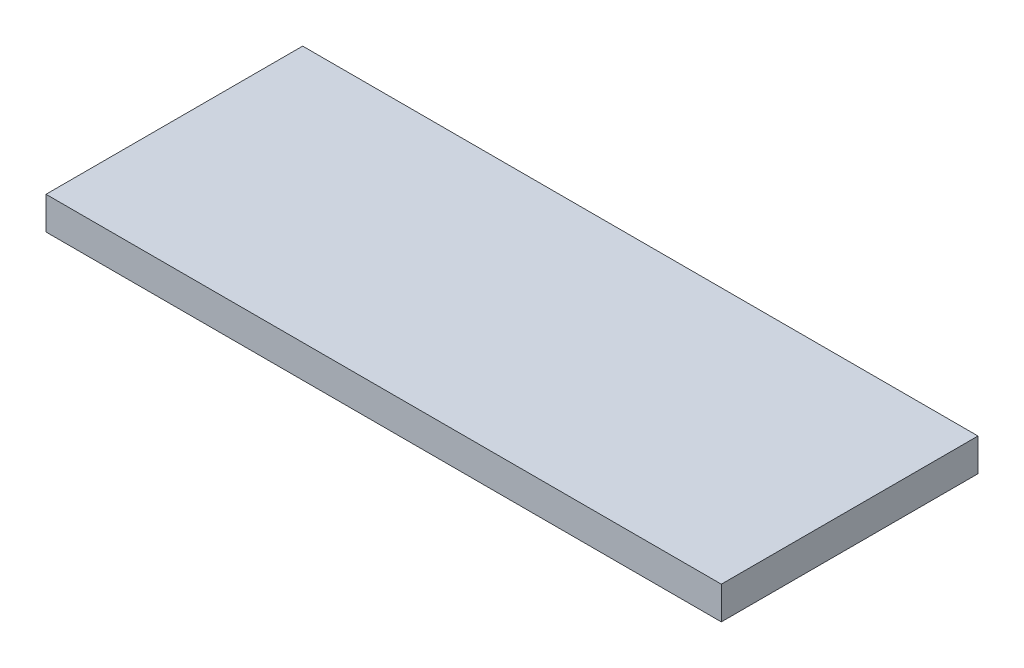
ISO-10303-21;
HEADER;
FILE_DESCRIPTION(('STEP AP214'),'2;1');
FILE_NAME('part.step','',(''),(''),'','','');
FILE_SCHEMA(('AUTOMOTIVE_DESIGN { 1 0 10303 214 1 1 1 1 }'));
ENDSEC;
DATA;
#1=APPLICATION_CONTEXT('core data for automotive mechanical design processes');
#2=APPLICATION_PROTOCOL_DEFINITION('international standard','automotive_design',2000,#1);
#3=PRODUCT_CONTEXT('',#1,'mechanical');
#4=PRODUCT('Part','Part','',(#3));
#5=PRODUCT_RELATED_PRODUCT_CATEGORY('part','',(#4));
#6=PRODUCT_DEFINITION_FORMATION('','',#4);
#7=PRODUCT_DEFINITION_CONTEXT('part definition',#1,'design');
#8=PRODUCT_DEFINITION('design','',#6,#7);
#9=PRODUCT_DEFINITION_SHAPE('','',#8);
#10=(LENGTH_UNIT() NAMED_UNIT(*) SI_UNIT(.MILLI.,.METRE.));
#11=(NAMED_UNIT(*) PLANE_ANGLE_UNIT() SI_UNIT($,.RADIAN.));
#12=(NAMED_UNIT(*) SI_UNIT($,.STERADIAN.) SOLID_ANGLE_UNIT());
#13=UNCERTAINTY_MEASURE_WITH_UNIT(LENGTH_MEASURE(1.E-05),#10,'distance_accuracy_value','');
#14=(GEOMETRIC_REPRESENTATION_CONTEXT(3) GLOBAL_UNCERTAINTY_ASSIGNED_CONTEXT((#13)) GLOBAL_UNIT_ASSIGNED_CONTEXT((#10,
#11,#12)) REPRESENTATION_CONTEXT('',''));
#15=CARTESIAN_POINT('',(0.,0.,0.));
#16=DIRECTION('',(0.,0.,1.));
#17=DIRECTION('',(1.,0.,0.));
#18=AXIS2_PLACEMENT_3D('',#15,#16,#17);
#19=CARTESIAN_POINT('',(0.,0.8509,0.));
#20=DIRECTION('',(1.,0.,0.));
#21=DIRECTION('',(0.,0.,-1.));
#22=AXIS2_PLACEMENT_3D('',#19,#20,#21);
#23=PLANE('',#22);
#24=DIRECTION('',(0.,0.,1.));
#25=VECTOR('',#24,1.);
#26=CARTESIAN_POINT('',(0.,0.,0.));
#27=LINE('',#26,#25);
#28=CARTESIAN_POINT('',(0.,0.,-6.6802));
#29=VERTEX_POINT('',#28);
#30=CARTESIAN_POINT('',(0.,0.,0.));
#31=VERTEX_POINT('',#30);
#32=EDGE_CURVE('E96',#29,#31,#27,.T.);
#33=ORIENTED_EDGE('',*,*,#32,.T.);
#34=DIRECTION('',(0.,-1.,0.));
#35=VECTOR('',#34,1.);
#36=CARTESIAN_POINT('',(0.,0.8509,0.));
#37=LINE('',#36,#35);
#38=CARTESIAN_POINT('',(0.,0.8509,0.));
#39=VERTEX_POINT('',#38);
#40=EDGE_CURVE('E11',#39,#31,#37,.T.);
#41=ORIENTED_EDGE('',*,*,#40,.F.);
#42=DIRECTION('',(0.,0.,1.));
#43=VECTOR('',#42,1.);
#44=CARTESIAN_POINT('',(0.,0.8509,0.));
#45=LINE('',#44,#43);
#46=CARTESIAN_POINT('',(0.,0.8509,-6.6802));
#47=VERTEX_POINT('',#46);
#48=EDGE_CURVE('E84',#47,#39,#45,.T.);
#49=ORIENTED_EDGE('',*,*,#48,.F.);
#50=DIRECTION('',(0.,-1.,0.));
#51=VECTOR('',#50,1.);
#52=CARTESIAN_POINT('',(0.,0.8509,-6.6802));
#53=LINE('',#52,#51);
#54=EDGE_CURVE('E92',#47,#29,#53,.T.);
#55=ORIENTED_EDGE('',*,*,#54,.T.);
#56=EDGE_LOOP('',(#33,#41,#49,#55));
#57=FACE_BOUND('',#56,.T.);
#58=ADVANCED_FACE('F33',(#57),#23,.F.);
#59=CARTESIAN_POINT('',(0.,0.8509,0.));
#60=DIRECTION('',(0.,0.,-1.));
#61=DIRECTION('',(-1.,0.,0.));
#62=AXIS2_PLACEMENT_3D('',#59,#60,#61);
#63=PLANE('',#62);
#64=DIRECTION('',(1.,0.,0.));
#65=VECTOR('',#64,1.);
#66=CARTESIAN_POINT('',(0.,0.,0.));
#67=LINE('',#66,#65);
#68=CARTESIAN_POINT('',(17.5768,0.,0.));
#69=VERTEX_POINT('',#68);
#70=EDGE_CURVE('E88',#31,#69,#67,.T.);
#71=ORIENTED_EDGE('',*,*,#70,.T.);
#72=DIRECTION('',(0.,-1.,0.));
#73=VECTOR('',#72,1.);
#74=CARTESIAN_POINT('',(17.5768,0.8509,0.));
#75=LINE('',#74,#73);
#76=CARTESIAN_POINT('',(17.5768,0.8509,0.));
#77=VERTEX_POINT('',#76);
#78=EDGE_CURVE('E41',#77,#69,#75,.T.);
#79=ORIENTED_EDGE('',*,*,#78,.F.);
#80=DIRECTION('',(1.,0.,0.));
#81=VECTOR('',#80,1.);
#82=CARTESIAN_POINT('',(0.,0.8509,0.));
#83=LINE('',#82,#81);
#84=EDGE_CURVE('E79',#39,#77,#83,.T.);
#85=ORIENTED_EDGE('',*,*,#84,.F.);
#86=ORIENTED_EDGE('',*,*,#40,.T.);
#87=EDGE_LOOP('',(#71,#79,#85,#86));
#88=FACE_BOUND('',#87,.T.);
#89=ADVANCED_FACE('F87',(#88),#63,.F.);
#90=CARTESIAN_POINT('',(17.5768,0.8509,0.));
#91=DIRECTION('',(-1.,0.,0.));
#92=DIRECTION('',(0.,0.,1.));
#93=AXIS2_PLACEMENT_3D('',#90,#91,#92);
#94=PLANE('',#93);
#95=DIRECTION('',(0.,0.,-1.));
#96=VECTOR('',#95,1.);
#97=CARTESIAN_POINT('',(17.5768,0.,0.));
#98=LINE('',#97,#96);
#99=CARTESIAN_POINT('',(17.5768,0.,-6.6802));
#100=VERTEX_POINT('',#99);
#101=EDGE_CURVE('E66',#69,#100,#98,.T.);
#102=ORIENTED_EDGE('',*,*,#101,.T.);
#103=DIRECTION('',(0.,-1.,0.));
#104=VECTOR('',#103,1.);
#105=CARTESIAN_POINT('',(17.5768,0.8509,-6.6802));
#106=LINE('',#105,#104);
#107=CARTESIAN_POINT('',(17.5768,0.8509,-6.6802));
#108=VERTEX_POINT('',#107);
#109=EDGE_CURVE('E89',#108,#100,#106,.T.);
#110=ORIENTED_EDGE('',*,*,#109,.F.);
#111=DIRECTION('',(0.,0.,-1.));
#112=VECTOR('',#111,1.);
#113=CARTESIAN_POINT('',(17.5768,0.8509,0.));
#114=LINE('',#113,#112);
#115=EDGE_CURVE('E82',#77,#108,#114,.T.);
#116=ORIENTED_EDGE('',*,*,#115,.F.);
#117=ORIENTED_EDGE('',*,*,#78,.T.);
#118=EDGE_LOOP('',(#102,#110,#116,#117));
#119=FACE_BOUND('',#118,.T.);
#120=ADVANCED_FACE('F90',(#119),#94,.F.);
#121=CARTESIAN_POINT('',(0.,0.8509,-6.6802));
#122=DIRECTION('',(0.,0.,1.));
#123=DIRECTION('',(1.,0.,0.));
#124=AXIS2_PLACEMENT_3D('',#121,#122,#123);
#125=PLANE('',#124);
#126=DIRECTION('',(-1.,0.,0.));
#127=VECTOR('',#126,1.);
#128=CARTESIAN_POINT('',(0.,0.,-6.6802));
#129=LINE('',#128,#127);
#130=EDGE_CURVE('E72',#100,#29,#129,.T.);
#131=ORIENTED_EDGE('',*,*,#130,.T.);
#132=ORIENTED_EDGE('',*,*,#54,.F.);
#133=DIRECTION('',(-1.,0.,0.));
#134=VECTOR('',#133,1.);
#135=CARTESIAN_POINT('',(0.,0.8509,-6.6802));
#136=LINE('',#135,#134);
#137=EDGE_CURVE('E49',#108,#47,#136,.T.);
#138=ORIENTED_EDGE('',*,*,#137,.F.);
#139=ORIENTED_EDGE('',*,*,#109,.T.);
#140=EDGE_LOOP('',(#131,#132,#138,#139));
#141=FACE_BOUND('',#140,.T.);
#142=ADVANCED_FACE('F103',(#141),#125,.F.);
#143=CARTESIAN_POINT('',(0.,0.8509,0.));
#144=DIRECTION('',(0.,-1.,0.));
#145=DIRECTION('',(0.,0.,-1.));
#146=AXIS2_PLACEMENT_3D('',#143,#144,#145);
#147=PLANE('',#146);
#148=ORIENTED_EDGE('',*,*,#48,.T.);
#149=ORIENTED_EDGE('',*,*,#84,.T.);
#150=ORIENTED_EDGE('',*,*,#115,.T.);
#151=ORIENTED_EDGE('',*,*,#137,.T.);
#152=EDGE_LOOP('',(#148,#149,#150,#151));
#153=FACE_BOUND('',#152,.T.);
#154=ADVANCED_FACE('F80',(#153),#147,.F.);
#155=CARTESIAN_POINT('',(0.,0.,0.));
#156=DIRECTION('',(0.,-1.,0.));
#157=DIRECTION('',(0.,0.,-1.));
#158=AXIS2_PLACEMENT_3D('',#155,#156,#157);
#159=PLANE('',#158);
#160=ORIENTED_EDGE('',*,*,#32,.F.);
#161=ORIENTED_EDGE('',*,*,#130,.F.);
#162=ORIENTED_EDGE('',*,*,#101,.F.);
#163=ORIENTED_EDGE('',*,*,#70,.F.);
#164=EDGE_LOOP('',(#160,#161,#162,#163));
#165=FACE_BOUND('',#164,.T.);
#166=ADVANCED_FACE('F106',(#165),#159,.T.);
#167=CLOSED_SHELL('',(#58,#89,#120,#142,#154,#166));
#168=MANIFOLD_SOLID_BREP('B2',#167);
#169=ADVANCED_BREP_SHAPE_REPRESENTATION('',(#18,#168),#14);
#170=SHAPE_DEFINITION_REPRESENTATION(#9,#169);
ENDSEC;
END-ISO-10303-21;
